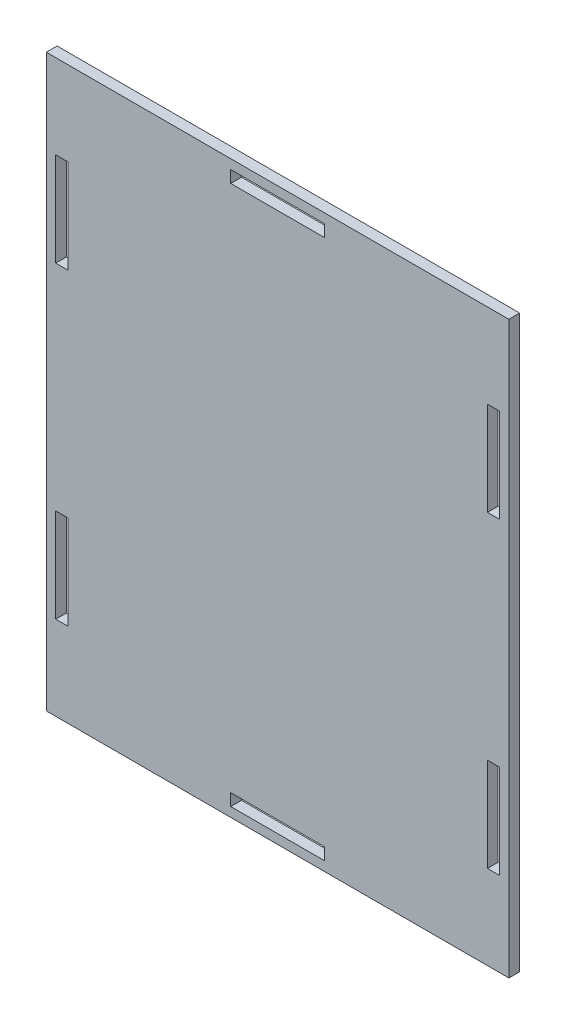
ISO-10303-21;
HEADER;
FILE_DESCRIPTION(('STEP AP214'),'2;1');
FILE_NAME('part.step','',(''),(''),'','','');
FILE_SCHEMA(('AUTOMOTIVE_DESIGN { 1 0 10303 214 1 1 1 1 }'));
ENDSEC;
DATA;
#1=APPLICATION_CONTEXT('core data for automotive mechanical design processes');
#2=APPLICATION_PROTOCOL_DEFINITION('international standard','automotive_design',2000,#1);
#3=PRODUCT_CONTEXT('',#1,'mechanical');
#4=PRODUCT('Part','Part','',(#3));
#5=PRODUCT_RELATED_PRODUCT_CATEGORY('part','',(#4));
#6=PRODUCT_DEFINITION_FORMATION('','',#4);
#7=PRODUCT_DEFINITION_CONTEXT('part definition',#1,'design');
#8=PRODUCT_DEFINITION('design','',#6,#7);
#9=PRODUCT_DEFINITION_SHAPE('','',#8);
#10=(LENGTH_UNIT() NAMED_UNIT(*) SI_UNIT(.MILLI.,.METRE.));
#11=(NAMED_UNIT(*) PLANE_ANGLE_UNIT() SI_UNIT($,.RADIAN.));
#12=(NAMED_UNIT(*) SI_UNIT($,.STERADIAN.) SOLID_ANGLE_UNIT());
#13=UNCERTAINTY_MEASURE_WITH_UNIT(LENGTH_MEASURE(1.E-05),#10,'distance_accuracy_value','');
#14=(GEOMETRIC_REPRESENTATION_CONTEXT(3) GLOBAL_UNCERTAINTY_ASSIGNED_CONTEXT((#13)) GLOBAL_UNIT_ASSIGNED_CONTEXT((#10,
#11,#12)) REPRESENTATION_CONTEXT('',''));
#15=CARTESIAN_POINT('',(0.,0.,0.));
#16=DIRECTION('',(0.,0.,1.));
#17=DIRECTION('',(1.,0.,0.));
#18=AXIS2_PLACEMENT_3D('',#15,#16,#17);
#19=CARTESIAN_POINT('',(0.,0.,3.5));
#20=DIRECTION('',(0.,0.,-1.));
#21=DIRECTION('',(-1.,0.,0.));
#22=AXIS2_PLACEMENT_3D('',#19,#20,#21);
#23=PLANE('',#22);
#24=DIRECTION('',(0.,1.,0.));
#25=VECTOR('',#24,1.);
#26=CARTESIAN_POINT('',(90.1999999999999,181.95,3.5));
#27=LINE('',#26,#25);
#28=CARTESIAN_POINT('',(90.1999999999999,178.05,3.5));
#29=VERTEX_POINT('',#28);
#30=CARTESIAN_POINT('',(90.1999999999999,181.95,3.5));
#31=VERTEX_POINT('',#30);
#32=EDGE_CURVE('E256',#29,#31,#27,.T.);
#33=ORIENTED_EDGE('',*,*,#32,.F.);
#34=DIRECTION('',(1.,0.,0.));
#35=VECTOR('',#34,1.);
#36=CARTESIAN_POINT('',(59.7999999999999,178.05,3.5));
#37=LINE('',#36,#35);
#38=CARTESIAN_POINT('',(59.7999999999999,178.05,3.5));
#39=VERTEX_POINT('',#38);
#40=EDGE_CURVE('E264',#39,#29,#37,.T.);
#41=ORIENTED_EDGE('',*,*,#40,.F.);
#42=DIRECTION('',(0.,-1.,0.));
#43=VECTOR('',#42,1.);
#44=CARTESIAN_POINT('',(59.7999999999999,181.95,3.5));
#45=LINE('',#44,#43);
#46=CARTESIAN_POINT('',(59.7999999999999,181.95,3.5));
#47=VERTEX_POINT('',#46);
#48=EDGE_CURVE('E261',#47,#39,#45,.T.);
#49=ORIENTED_EDGE('',*,*,#48,.F.);
#50=DIRECTION('',(-1.,0.,0.));
#51=VECTOR('',#50,1.);
#52=CARTESIAN_POINT('',(59.7999999999999,181.95,3.5));
#53=LINE('',#52,#51);
#54=EDGE_CURVE('E258',#31,#47,#53,.T.);
#55=ORIENTED_EDGE('',*,*,#54,.F.);
#56=EDGE_LOOP('',(#33,#41,#49,#55));
#57=FACE_BOUND('',#56,.T.);
#58=DIRECTION('',(0.,1.,0.));
#59=VECTOR('',#58,1.);
#60=CARTESIAN_POINT('',(146.95,57.7,3.5));
#61=LINE('',#60,#59);
#62=CARTESIAN_POINT('',(146.95,27.3,3.5));
#63=VERTEX_POINT('',#62);
#64=CARTESIAN_POINT('',(146.95,57.7,3.5));
#65=VERTEX_POINT('',#64);
#66=EDGE_CURVE('E318',#63,#65,#61,.T.);
#67=ORIENTED_EDGE('',*,*,#66,.F.);
#68=DIRECTION('',(1.,0.,0.));
#69=VECTOR('',#68,1.);
#70=CARTESIAN_POINT('',(146.95,27.3,3.5));
#71=LINE('',#70,#69);
#72=CARTESIAN_POINT('',(143.05,27.3,3.5));
#73=VERTEX_POINT('',#72);
#74=EDGE_CURVE('E326',#73,#63,#71,.T.);
#75=ORIENTED_EDGE('',*,*,#74,.F.);
#76=DIRECTION('',(0.,-1.,0.));
#77=VECTOR('',#76,1.);
#78=CARTESIAN_POINT('',(143.05,57.7,3.5));
#79=LINE('',#78,#77);
#80=CARTESIAN_POINT('',(143.05,57.7,3.5));
#81=VERTEX_POINT('',#80);
#82=EDGE_CURVE('E323',#81,#73,#79,.T.);
#83=ORIENTED_EDGE('',*,*,#82,.F.);
#84=DIRECTION('',(-1.,0.,0.));
#85=VECTOR('',#84,1.);
#86=CARTESIAN_POINT('',(146.95,57.7,3.5));
#87=LINE('',#86,#85);
#88=EDGE_CURVE('E320',#65,#81,#87,.T.);
#89=ORIENTED_EDGE('',*,*,#88,.F.);
#90=EDGE_LOOP('',(#67,#75,#83,#89));
#91=FACE_BOUND('',#90,.T.);
#92=DIRECTION('',(0.,-1.,0.));
#93=VECTOR('',#92,1.);
#94=CARTESIAN_POINT('',(3.05,57.7,3.5));
#95=LINE('',#94,#93);
#96=CARTESIAN_POINT('',(3.05,57.7,3.5));
#97=VERTEX_POINT('',#96);
#98=CARTESIAN_POINT('',(3.05,27.3,3.5));
#99=VERTEX_POINT('',#98);
#100=EDGE_CURVE('E380',#97,#99,#95,.T.);
#101=ORIENTED_EDGE('',*,*,#100,.F.);
#102=DIRECTION('',(-1.,0.,0.));
#103=VECTOR('',#102,1.);
#104=CARTESIAN_POINT('',(3.05,57.7,3.5));
#105=LINE('',#104,#103);
#106=CARTESIAN_POINT('',(6.95,57.7,3.5));
#107=VERTEX_POINT('',#106);
#108=EDGE_CURVE('E388',#107,#97,#105,.T.);
#109=ORIENTED_EDGE('',*,*,#108,.F.);
#110=DIRECTION('',(0.,1.,0.));
#111=VECTOR('',#110,1.);
#112=CARTESIAN_POINT('',(6.95,57.7,3.5));
#113=LINE('',#112,#111);
#114=CARTESIAN_POINT('',(6.95,27.3,3.5));
#115=VERTEX_POINT('',#114);
#116=EDGE_CURVE('E385',#115,#107,#113,.T.);
#117=ORIENTED_EDGE('',*,*,#116,.F.);
#118=DIRECTION('',(1.,0.,0.));
#119=VECTOR('',#118,1.);
#120=CARTESIAN_POINT('',(3.05,27.3,3.5));
#121=LINE('',#120,#119);
#122=EDGE_CURVE('E382',#99,#115,#121,.T.);
#123=ORIENTED_EDGE('',*,*,#122,.F.);
#124=EDGE_LOOP('',(#101,#109,#117,#123));
#125=FACE_BOUND('',#124,.T.);
#126=DIRECTION('',(0.,-1.,0.));
#127=VECTOR('',#126,1.);
#128=CARTESIAN_POINT('',(0.,0.,3.5));
#129=LINE('',#128,#127);
#130=CARTESIAN_POINT('',(0.,185.,3.5));
#131=VERTEX_POINT('',#130);
#132=CARTESIAN_POINT('',(0.,0.,3.5));
#133=VERTEX_POINT('',#132);
#134=EDGE_CURVE('E411',#131,#133,#129,.T.);
#135=ORIENTED_EDGE('',*,*,#134,.T.);
#136=DIRECTION('',(1.,0.,0.));
#137=VECTOR('',#136,1.);
#138=CARTESIAN_POINT('',(0.,0.,3.5));
#139=LINE('',#138,#137);
#140=CARTESIAN_POINT('',(150.,0.,3.5));
#141=VERTEX_POINT('',#140);
#142=EDGE_CURVE('E414',#133,#141,#139,.T.);
#143=ORIENTED_EDGE('',*,*,#142,.T.);
#144=DIRECTION('',(0.,1.,0.));
#145=VECTOR('',#144,1.);
#146=CARTESIAN_POINT('',(150.,0.,3.5));
#147=LINE('',#146,#145);
#148=CARTESIAN_POINT('',(150.,185.,3.5));
#149=VERTEX_POINT('',#148);
#150=EDGE_CURVE('E417',#141,#149,#147,.T.);
#151=ORIENTED_EDGE('',*,*,#150,.T.);
#152=DIRECTION('',(-1.,0.,0.));
#153=VECTOR('',#152,1.);
#154=CARTESIAN_POINT('',(0.,185.,3.5));
#155=LINE('',#154,#153);
#156=EDGE_CURVE('E419',#149,#131,#155,.T.);
#157=ORIENTED_EDGE('',*,*,#156,.T.);
#158=EDGE_LOOP('',(#135,#143,#151,#157));
#159=FACE_BOUND('',#158,.T.);
#160=DIRECTION('',(0.,-1.,0.));
#161=VECTOR('',#160,1.);
#162=CARTESIAN_POINT('',(3.05,157.7,3.5));
#163=LINE('',#162,#161);
#164=CARTESIAN_POINT('',(3.05,157.7,3.5));
#165=VERTEX_POINT('',#164);
#166=CARTESIAN_POINT('',(3.05,127.3,3.5));
#167=VERTEX_POINT('',#166);
#168=EDGE_CURVE('E349',#165,#167,#163,.T.);
#169=ORIENTED_EDGE('',*,*,#168,.F.);
#170=DIRECTION('',(-1.,0.,0.));
#171=VECTOR('',#170,1.);
#172=CARTESIAN_POINT('',(3.05,157.7,3.5));
#173=LINE('',#172,#171);
#174=CARTESIAN_POINT('',(6.95,157.7,3.5));
#175=VERTEX_POINT('',#174);
#176=EDGE_CURVE('E357',#175,#165,#173,.T.);
#177=ORIENTED_EDGE('',*,*,#176,.F.);
#178=DIRECTION('',(0.,1.,0.));
#179=VECTOR('',#178,1.);
#180=CARTESIAN_POINT('',(6.95,157.7,3.5));
#181=LINE('',#180,#179);
#182=CARTESIAN_POINT('',(6.95,127.3,3.5));
#183=VERTEX_POINT('',#182);
#184=EDGE_CURVE('E354',#183,#175,#181,.T.);
#185=ORIENTED_EDGE('',*,*,#184,.F.);
#186=DIRECTION('',(1.,0.,0.));
#187=VECTOR('',#186,1.);
#188=CARTESIAN_POINT('',(3.05,127.3,3.5));
#189=LINE('',#188,#187);
#190=EDGE_CURVE('E351',#167,#183,#189,.T.);
#191=ORIENTED_EDGE('',*,*,#190,.F.);
#192=EDGE_LOOP('',(#169,#177,#185,#191));
#193=FACE_BOUND('',#192,.T.);
#194=DIRECTION('',(0.,1.,0.));
#195=VECTOR('',#194,1.);
#196=CARTESIAN_POINT('',(146.95,157.7,3.5));
#197=LINE('',#196,#195);
#198=CARTESIAN_POINT('',(146.95,127.3,3.5));
#199=VERTEX_POINT('',#198);
#200=CARTESIAN_POINT('',(146.95,157.7,3.5));
#201=VERTEX_POINT('',#200);
#202=EDGE_CURVE('E287',#199,#201,#197,.T.);
#203=ORIENTED_EDGE('',*,*,#202,.F.);
#204=DIRECTION('',(1.,0.,0.));
#205=VECTOR('',#204,1.);
#206=CARTESIAN_POINT('',(146.95,127.3,3.5));
#207=LINE('',#206,#205);
#208=CARTESIAN_POINT('',(143.05,127.3,3.5));
#209=VERTEX_POINT('',#208);
#210=EDGE_CURVE('E295',#209,#199,#207,.T.);
#211=ORIENTED_EDGE('',*,*,#210,.F.);
#212=DIRECTION('',(0.,-1.,0.));
#213=VECTOR('',#212,1.);
#214=CARTESIAN_POINT('',(143.05,157.7,3.5));
#215=LINE('',#214,#213);
#216=CARTESIAN_POINT('',(143.05,157.7,3.5));
#217=VERTEX_POINT('',#216);
#218=EDGE_CURVE('E292',#217,#209,#215,.T.);
#219=ORIENTED_EDGE('',*,*,#218,.F.);
#220=DIRECTION('',(-1.,0.,0.));
#221=VECTOR('',#220,1.);
#222=CARTESIAN_POINT('',(146.95,157.7,3.5));
#223=LINE('',#222,#221);
#224=EDGE_CURVE('E289',#201,#217,#223,.T.);
#225=ORIENTED_EDGE('',*,*,#224,.F.);
#226=EDGE_LOOP('',(#203,#211,#219,#225));
#227=FACE_BOUND('',#226,.T.);
#228=DIRECTION('',(0.,-1.,0.));
#229=VECTOR('',#228,1.);
#230=CARTESIAN_POINT('',(59.7999999999999,3.05,3.5));
#231=LINE('',#230,#229);
#232=CARTESIAN_POINT('',(59.7999999999999,6.94999999999998,3.5));
#233=VERTEX_POINT('',#232);
#234=CARTESIAN_POINT('',(59.7999999999999,3.05,3.5));
#235=VERTEX_POINT('',#234);
#236=EDGE_CURVE('E220',#233,#235,#231,.T.);
#237=ORIENTED_EDGE('',*,*,#236,.F.);
#238=DIRECTION('',(-1.,0.,0.));
#239=VECTOR('',#238,1.);
#240=CARTESIAN_POINT('',(59.7999999999999,6.94999999999998,3.5));
#241=LINE('',#240,#239);
#242=CARTESIAN_POINT('',(90.1999999999999,6.94999999999998,3.5));
#243=VERTEX_POINT('',#242);
#244=EDGE_CURVE('E242',#243,#233,#241,.T.);
#245=ORIENTED_EDGE('',*,*,#244,.F.);
#246=DIRECTION('',(0.,1.,0.));
#247=VECTOR('',#246,1.);
#248=CARTESIAN_POINT('',(90.1999999999999,3.05,3.5));
#249=LINE('',#248,#247);
#250=CARTESIAN_POINT('',(90.1999999999999,3.05,3.5));
#251=VERTEX_POINT('',#250);
#252=EDGE_CURVE('E240',#251,#243,#249,.T.);
#253=ORIENTED_EDGE('',*,*,#252,.F.);
#254=DIRECTION('',(1.,0.,0.));
#255=VECTOR('',#254,1.);
#256=CARTESIAN_POINT('',(59.7999999999999,3.05,3.5));
#257=LINE('',#256,#255);
#258=EDGE_CURVE('E228',#235,#251,#257,.T.);
#259=ORIENTED_EDGE('',*,*,#258,.F.);
#260=EDGE_LOOP('',(#237,#245,#253,#259));
#261=FACE_BOUND('',#260,.T.);
#262=ADVANCED_FACE('F35',(#57,#91,#125,#159,#193,#227,#261),#23,.F.);
#263=CARTESIAN_POINT('',(0.,0.,0.));
#264=DIRECTION('',(0.,0.,-1.));
#265=DIRECTION('',(-1.,0.,0.));
#266=AXIS2_PLACEMENT_3D('',#263,#264,#265);
#267=PLANE('',#266);
#268=DIRECTION('',(0.,-1.,0.));
#269=VECTOR('',#268,1.);
#270=CARTESIAN_POINT('',(0.,0.,0.));
#271=LINE('',#270,#269);
#272=CARTESIAN_POINT('',(0.,185.,0.));
#273=VERTEX_POINT('',#272);
#274=CARTESIAN_POINT('',(0.,0.,0.));
#275=VERTEX_POINT('',#274);
#276=EDGE_CURVE('E410',#273,#275,#271,.T.);
#277=ORIENTED_EDGE('',*,*,#276,.F.);
#278=DIRECTION('',(-1.,0.,0.));
#279=VECTOR('',#278,1.);
#280=CARTESIAN_POINT('',(0.,185.,0.));
#281=LINE('',#280,#279);
#282=CARTESIAN_POINT('',(150.,185.,0.));
#283=VERTEX_POINT('',#282);
#284=EDGE_CURVE('E415',#283,#273,#281,.T.);
#285=ORIENTED_EDGE('',*,*,#284,.F.);
#286=DIRECTION('',(0.,1.,0.));
#287=VECTOR('',#286,1.);
#288=CARTESIAN_POINT('',(150.,0.,0.));
#289=LINE('',#288,#287);
#290=CARTESIAN_POINT('',(150.,0.,0.));
#291=VERTEX_POINT('',#290);
#292=EDGE_CURVE('E426',#291,#283,#289,.T.);
#293=ORIENTED_EDGE('',*,*,#292,.F.);
#294=DIRECTION('',(1.,0.,0.));
#295=VECTOR('',#294,1.);
#296=CARTESIAN_POINT('',(0.,0.,0.));
#297=LINE('',#296,#295);
#298=EDGE_CURVE('E424',#275,#291,#297,.T.);
#299=ORIENTED_EDGE('',*,*,#298,.F.);
#300=EDGE_LOOP('',(#277,#285,#293,#299));
#301=FACE_BOUND('',#300,.T.);
#302=DIRECTION('',(-1.,0.,0.));
#303=VECTOR('',#302,1.);
#304=CARTESIAN_POINT('',(3.05,57.7,0.));
#305=LINE('',#304,#303);
#306=CARTESIAN_POINT('',(6.95,57.7,0.));
#307=VERTEX_POINT('',#306);
#308=CARTESIAN_POINT('',(3.05,57.7,0.));
#309=VERTEX_POINT('',#308);
#310=EDGE_CURVE('E383',#307,#309,#305,.T.);
#311=ORIENTED_EDGE('',*,*,#310,.T.);
#312=DIRECTION('',(0.,-1.,0.));
#313=VECTOR('',#312,1.);
#314=CARTESIAN_POINT('',(3.05,57.7,0.));
#315=LINE('',#314,#313);
#316=CARTESIAN_POINT('',(3.05,27.3,0.));
#317=VERTEX_POINT('',#316);
#318=EDGE_CURVE('E379',#309,#317,#315,.T.);
#319=ORIENTED_EDGE('',*,*,#318,.T.);
#320=DIRECTION('',(1.,0.,0.));
#321=VECTOR('',#320,1.);
#322=CARTESIAN_POINT('',(3.05,27.3,0.));
#323=LINE('',#322,#321);
#324=CARTESIAN_POINT('',(6.95,27.3,0.));
#325=VERTEX_POINT('',#324);
#326=EDGE_CURVE('E393',#317,#325,#323,.T.);
#327=ORIENTED_EDGE('',*,*,#326,.T.);
#328=DIRECTION('',(0.,1.,0.));
#329=VECTOR('',#328,1.);
#330=CARTESIAN_POINT('',(6.95,57.7,0.));
#331=LINE('',#330,#329);
#332=EDGE_CURVE('E396',#325,#307,#331,.T.);
#333=ORIENTED_EDGE('',*,*,#332,.T.);
#334=EDGE_LOOP('',(#311,#319,#327,#333));
#335=FACE_BOUND('',#334,.T.);
#336=DIRECTION('',(-1.,0.,0.));
#337=VECTOR('',#336,1.);
#338=CARTESIAN_POINT('',(3.05,157.7,0.));
#339=LINE('',#338,#337);
#340=CARTESIAN_POINT('',(6.95,157.7,0.));
#341=VERTEX_POINT('',#340);
#342=CARTESIAN_POINT('',(3.05,157.7,0.));
#343=VERTEX_POINT('',#342);
#344=EDGE_CURVE('E352',#341,#343,#339,.T.);
#345=ORIENTED_EDGE('',*,*,#344,.T.);
#346=DIRECTION('',(0.,-1.,0.));
#347=VECTOR('',#346,1.);
#348=CARTESIAN_POINT('',(3.05,157.7,0.));
#349=LINE('',#348,#347);
#350=CARTESIAN_POINT('',(3.05,127.3,0.));
#351=VERTEX_POINT('',#350);
#352=EDGE_CURVE('E348',#343,#351,#349,.T.);
#353=ORIENTED_EDGE('',*,*,#352,.T.);
#354=DIRECTION('',(1.,0.,0.));
#355=VECTOR('',#354,1.);
#356=CARTESIAN_POINT('',(3.05,127.3,0.));
#357=LINE('',#356,#355);
#358=CARTESIAN_POINT('',(6.95,127.3,0.));
#359=VERTEX_POINT('',#358);
#360=EDGE_CURVE('E362',#351,#359,#357,.T.);
#361=ORIENTED_EDGE('',*,*,#360,.T.);
#362=DIRECTION('',(0.,1.,0.));
#363=VECTOR('',#362,1.);
#364=CARTESIAN_POINT('',(6.95,157.7,0.));
#365=LINE('',#364,#363);
#366=EDGE_CURVE('E365',#359,#341,#365,.T.);
#367=ORIENTED_EDGE('',*,*,#366,.T.);
#368=EDGE_LOOP('',(#345,#353,#361,#367));
#369=FACE_BOUND('',#368,.T.);
#370=DIRECTION('',(1.,0.,0.));
#371=VECTOR('',#370,1.);
#372=CARTESIAN_POINT('',(146.95,27.3,0.));
#373=LINE('',#372,#371);
#374=CARTESIAN_POINT('',(143.05,27.3,0.));
#375=VERTEX_POINT('',#374);
#376=CARTESIAN_POINT('',(146.95,27.3,0.));
#377=VERTEX_POINT('',#376);
#378=EDGE_CURVE('E321',#375,#377,#373,.T.);
#379=ORIENTED_EDGE('',*,*,#378,.T.);
#380=DIRECTION('',(0.,1.,0.));
#381=VECTOR('',#380,1.);
#382=CARTESIAN_POINT('',(146.95,57.7,0.));
#383=LINE('',#382,#381);
#384=CARTESIAN_POINT('',(146.95,57.7,0.));
#385=VERTEX_POINT('',#384);
#386=EDGE_CURVE('E317',#377,#385,#383,.T.);
#387=ORIENTED_EDGE('',*,*,#386,.T.);
#388=DIRECTION('',(-1.,0.,0.));
#389=VECTOR('',#388,1.);
#390=CARTESIAN_POINT('',(146.95,57.7,0.));
#391=LINE('',#390,#389);
#392=CARTESIAN_POINT('',(143.05,57.7,0.));
#393=VERTEX_POINT('',#392);
#394=EDGE_CURVE('E331',#385,#393,#391,.T.);
#395=ORIENTED_EDGE('',*,*,#394,.T.);
#396=DIRECTION('',(0.,-1.,0.));
#397=VECTOR('',#396,1.);
#398=CARTESIAN_POINT('',(143.05,57.7,0.));
#399=LINE('',#398,#397);
#400=EDGE_CURVE('E334',#393,#375,#399,.T.);
#401=ORIENTED_EDGE('',*,*,#400,.T.);
#402=EDGE_LOOP('',(#379,#387,#395,#401));
#403=FACE_BOUND('',#402,.T.);
#404=DIRECTION('',(1.,0.,0.));
#405=VECTOR('',#404,1.);
#406=CARTESIAN_POINT('',(146.95,127.3,0.));
#407=LINE('',#406,#405);
#408=CARTESIAN_POINT('',(143.05,127.3,0.));
#409=VERTEX_POINT('',#408);
#410=CARTESIAN_POINT('',(146.95,127.3,0.));
#411=VERTEX_POINT('',#410);
#412=EDGE_CURVE('E290',#409,#411,#407,.T.);
#413=ORIENTED_EDGE('',*,*,#412,.T.);
#414=DIRECTION('',(0.,1.,0.));
#415=VECTOR('',#414,1.);
#416=CARTESIAN_POINT('',(146.95,157.7,0.));
#417=LINE('',#416,#415);
#418=CARTESIAN_POINT('',(146.95,157.7,0.));
#419=VERTEX_POINT('',#418);
#420=EDGE_CURVE('E286',#411,#419,#417,.T.);
#421=ORIENTED_EDGE('',*,*,#420,.T.);
#422=DIRECTION('',(-1.,0.,0.));
#423=VECTOR('',#422,1.);
#424=CARTESIAN_POINT('',(146.95,157.7,0.));
#425=LINE('',#424,#423);
#426=CARTESIAN_POINT('',(143.05,157.7,0.));
#427=VERTEX_POINT('',#426);
#428=EDGE_CURVE('E300',#419,#427,#425,.T.);
#429=ORIENTED_EDGE('',*,*,#428,.T.);
#430=DIRECTION('',(0.,-1.,0.));
#431=VECTOR('',#430,1.);
#432=CARTESIAN_POINT('',(143.05,157.7,0.));
#433=LINE('',#432,#431);
#434=EDGE_CURVE('E303',#427,#409,#433,.T.);
#435=ORIENTED_EDGE('',*,*,#434,.T.);
#436=EDGE_LOOP('',(#413,#421,#429,#435));
#437=FACE_BOUND('',#436,.T.);
#438=DIRECTION('',(1.,0.,0.));
#439=VECTOR('',#438,1.);
#440=CARTESIAN_POINT('',(59.7999999999999,178.05,0.));
#441=LINE('',#440,#439);
#442=CARTESIAN_POINT('',(59.7999999999999,178.05,0.));
#443=VERTEX_POINT('',#442);
#444=CARTESIAN_POINT('',(90.1999999999999,178.05,0.));
#445=VERTEX_POINT('',#444);
#446=EDGE_CURVE('E259',#443,#445,#441,.T.);
#447=ORIENTED_EDGE('',*,*,#446,.T.);
#448=DIRECTION('',(0.,1.,0.));
#449=VECTOR('',#448,1.);
#450=CARTESIAN_POINT('',(90.1999999999999,181.95,0.));
#451=LINE('',#450,#449);
#452=CARTESIAN_POINT('',(90.1999999999999,181.95,0.));
#453=VERTEX_POINT('',#452);
#454=EDGE_CURVE('E236',#445,#453,#451,.T.);
#455=ORIENTED_EDGE('',*,*,#454,.T.);
#456=DIRECTION('',(-1.,0.,0.));
#457=VECTOR('',#456,1.);
#458=CARTESIAN_POINT('',(59.7999999999999,181.95,0.));
#459=LINE('',#458,#457);
#460=CARTESIAN_POINT('',(59.7999999999999,181.95,0.));
#461=VERTEX_POINT('',#460);
#462=EDGE_CURVE('E269',#453,#461,#459,.T.);
#463=ORIENTED_EDGE('',*,*,#462,.T.);
#464=DIRECTION('',(0.,-1.,0.));
#465=VECTOR('',#464,1.);
#466=CARTESIAN_POINT('',(59.7999999999999,181.95,0.));
#467=LINE('',#466,#465);
#468=EDGE_CURVE('E272',#461,#443,#467,.T.);
#469=ORIENTED_EDGE('',*,*,#468,.T.);
#470=EDGE_LOOP('',(#447,#455,#463,#469));
#471=FACE_BOUND('',#470,.T.);
#472=DIRECTION('',(-1.,0.,0.));
#473=VECTOR('',#472,1.);
#474=CARTESIAN_POINT('',(59.7999999999999,6.94999999999998,0.));
#475=LINE('',#474,#473);
#476=CARTESIAN_POINT('',(90.1999999999999,6.94999999999998,0.));
#477=VERTEX_POINT('',#476);
#478=CARTESIAN_POINT('',(59.7999999999999,6.94999999999998,0.));
#479=VERTEX_POINT('',#478);
#480=EDGE_CURVE('E229',#477,#479,#475,.T.);
#481=ORIENTED_EDGE('',*,*,#480,.T.);
#482=DIRECTION('',(0.,-1.,0.));
#483=VECTOR('',#482,1.);
#484=CARTESIAN_POINT('',(59.7999999999999,3.05,0.));
#485=LINE('',#484,#483);
#486=CARTESIAN_POINT('',(59.7999999999999,3.05,0.));
#487=VERTEX_POINT('',#486);
#488=EDGE_CURVE('E58',#479,#487,#485,.T.);
#489=ORIENTED_EDGE('',*,*,#488,.T.);
#490=DIRECTION('',(1.,0.,0.));
#491=VECTOR('',#490,1.);
#492=CARTESIAN_POINT('',(59.7999999999999,3.05,0.));
#493=LINE('',#492,#491);
#494=CARTESIAN_POINT('',(90.1999999999999,3.05,0.));
#495=VERTEX_POINT('',#494);
#496=EDGE_CURVE('E235',#487,#495,#493,.T.);
#497=ORIENTED_EDGE('',*,*,#496,.T.);
#498=DIRECTION('',(0.,1.,0.));
#499=VECTOR('',#498,1.);
#500=CARTESIAN_POINT('',(90.1999999999999,3.05,0.));
#501=LINE('',#500,#499);
#502=EDGE_CURVE('E248',#495,#477,#501,.T.);
#503=ORIENTED_EDGE('',*,*,#502,.T.);
#504=EDGE_LOOP('',(#481,#489,#497,#503));
#505=FACE_BOUND('',#504,.T.);
#506=ADVANCED_FACE('F444',(#301,#335,#369,#403,#437,#471,#505),#267,.T.);
#507=CARTESIAN_POINT('',(0.,0.,3.5));
#508=DIRECTION('',(1.,0.,0.));
#509=DIRECTION('',(0.,0.,-1.));
#510=AXIS2_PLACEMENT_3D('',#507,#508,#509);
#511=PLANE('',#510);
#512=ORIENTED_EDGE('',*,*,#276,.T.);
#513=DIRECTION('',(0.,0.,-1.));
#514=VECTOR('',#513,1.);
#515=CARTESIAN_POINT('',(0.,0.,3.5));
#516=LINE('',#515,#514);
#517=EDGE_CURVE('E11',#133,#275,#516,.T.);
#518=ORIENTED_EDGE('',*,*,#517,.F.);
#519=ORIENTED_EDGE('',*,*,#134,.F.);
#520=DIRECTION('',(0.,0.,-1.));
#521=VECTOR('',#520,1.);
#522=CARTESIAN_POINT('',(0.,185.,3.5));
#523=LINE('',#522,#521);
#524=EDGE_CURVE('E421',#131,#273,#523,.T.);
#525=ORIENTED_EDGE('',*,*,#524,.T.);
#526=EDGE_LOOP('',(#512,#518,#519,#525));
#527=FACE_BOUND('',#526,.T.);
#528=ADVANCED_FACE('F37',(#527),#511,.F.);
#529=CARTESIAN_POINT('',(0.,0.,3.5));
#530=DIRECTION('',(0.,1.,0.));
#531=DIRECTION('',(0.,0.,1.));
#532=AXIS2_PLACEMENT_3D('',#529,#530,#531);
#533=PLANE('',#532);
#534=ORIENTED_EDGE('',*,*,#298,.T.);
#535=DIRECTION('',(0.,0.,-1.));
#536=VECTOR('',#535,1.);
#537=CARTESIAN_POINT('',(150.,0.,3.5));
#538=LINE('',#537,#536);
#539=EDGE_CURVE('E43',#141,#291,#538,.T.);
#540=ORIENTED_EDGE('',*,*,#539,.F.);
#541=ORIENTED_EDGE('',*,*,#142,.F.);
#542=ORIENTED_EDGE('',*,*,#517,.T.);
#543=EDGE_LOOP('',(#534,#540,#541,#542));
#544=FACE_BOUND('',#543,.T.);
#545=ADVANCED_FACE('F455',(#544),#533,.F.);
#546=CARTESIAN_POINT('',(150.,0.,3.5));
#547=DIRECTION('',(-1.,0.,0.));
#548=DIRECTION('',(0.,0.,1.));
#549=AXIS2_PLACEMENT_3D('',#546,#547,#548);
#550=PLANE('',#549);
#551=ORIENTED_EDGE('',*,*,#292,.T.);
#552=DIRECTION('',(0.,0.,-1.));
#553=VECTOR('',#552,1.);
#554=CARTESIAN_POINT('',(150.,185.,3.5));
#555=LINE('',#554,#553);
#556=EDGE_CURVE('E431',#149,#283,#555,.T.);
#557=ORIENTED_EDGE('',*,*,#556,.F.);
#558=ORIENTED_EDGE('',*,*,#150,.F.);
#559=ORIENTED_EDGE('',*,*,#539,.T.);
#560=EDGE_LOOP('',(#551,#557,#558,#559));
#561=FACE_BOUND('',#560,.T.);
#562=ADVANCED_FACE('F438',(#561),#550,.F.);
#563=CARTESIAN_POINT('',(0.,185.,3.5));
#564=DIRECTION('',(0.,-1.,0.));
#565=DIRECTION('',(0.,0.,-1.));
#566=AXIS2_PLACEMENT_3D('',#563,#564,#565);
#567=PLANE('',#566);
#568=ORIENTED_EDGE('',*,*,#284,.T.);
#569=ORIENTED_EDGE('',*,*,#524,.F.);
#570=ORIENTED_EDGE('',*,*,#156,.F.);
#571=ORIENTED_EDGE('',*,*,#556,.T.);
#572=EDGE_LOOP('',(#568,#569,#570,#571));
#573=FACE_BOUND('',#572,.T.);
#574=ADVANCED_FACE('F448',(#573),#567,.F.);
#575=CARTESIAN_POINT('',(3.05,57.7,3.5));
#576=DIRECTION('',(1.,0.,0.));
#577=DIRECTION('',(0.,0.,-1.));
#578=AXIS2_PLACEMENT_3D('',#575,#576,#577);
#579=PLANE('',#578);
#580=ORIENTED_EDGE('',*,*,#318,.F.);
#581=DIRECTION('',(0.,0.,-1.));
#582=VECTOR('',#581,1.);
#583=CARTESIAN_POINT('',(3.05,57.7,3.5));
#584=LINE('',#583,#582);
#585=EDGE_CURVE('E390',#97,#309,#584,.T.);
#586=ORIENTED_EDGE('',*,*,#585,.F.);
#587=ORIENTED_EDGE('',*,*,#100,.T.);
#588=DIRECTION('',(0.,0.,-1.));
#589=VECTOR('',#588,1.);
#590=CARTESIAN_POINT('',(3.05,27.3,3.5));
#591=LINE('',#590,#589);
#592=EDGE_CURVE('E407',#99,#317,#591,.T.);
#593=ORIENTED_EDGE('',*,*,#592,.T.);
#594=EDGE_LOOP('',(#580,#586,#587,#593));
#595=FACE_BOUND('',#594,.T.);
#596=ADVANCED_FACE('F472',(#595),#579,.T.);
#597=CARTESIAN_POINT('',(3.05,27.3,3.5));
#598=DIRECTION('',(0.,1.,0.));
#599=DIRECTION('',(0.,0.,1.));
#600=AXIS2_PLACEMENT_3D('',#597,#598,#599);
#601=PLANE('',#600);
#602=ORIENTED_EDGE('',*,*,#326,.F.);
#603=ORIENTED_EDGE('',*,*,#592,.F.);
#604=ORIENTED_EDGE('',*,*,#122,.T.);
#605=DIRECTION('',(0.,0.,-1.));
#606=VECTOR('',#605,1.);
#607=CARTESIAN_POINT('',(6.95,27.3,3.5));
#608=LINE('',#607,#606);
#609=EDGE_CURVE('E405',#115,#325,#608,.T.);
#610=ORIENTED_EDGE('',*,*,#609,.T.);
#611=EDGE_LOOP('',(#602,#603,#604,#610));
#612=FACE_BOUND('',#611,.T.);
#613=ADVANCED_FACE('F479',(#612),#601,.T.);
#614=CARTESIAN_POINT('',(6.95,57.7,3.5));
#615=DIRECTION('',(-1.,0.,0.));
#616=DIRECTION('',(0.,0.,1.));
#617=AXIS2_PLACEMENT_3D('',#614,#615,#616);
#618=PLANE('',#617);
#619=ORIENTED_EDGE('',*,*,#332,.F.);
#620=ORIENTED_EDGE('',*,*,#609,.F.);
#621=ORIENTED_EDGE('',*,*,#116,.T.);
#622=DIRECTION('',(0.,0.,-1.));
#623=VECTOR('',#622,1.);
#624=CARTESIAN_POINT('',(6.95,57.7,3.5));
#625=LINE('',#624,#623);
#626=EDGE_CURVE('E403',#107,#307,#625,.T.);
#627=ORIENTED_EDGE('',*,*,#626,.T.);
#628=EDGE_LOOP('',(#619,#620,#621,#627));
#629=FACE_BOUND('',#628,.T.);
#630=ADVANCED_FACE('F484',(#629),#618,.T.);
#631=CARTESIAN_POINT('',(3.05,57.7,3.5));
#632=DIRECTION('',(0.,-1.,0.));
#633=DIRECTION('',(0.,0.,-1.));
#634=AXIS2_PLACEMENT_3D('',#631,#632,#633);
#635=PLANE('',#634);
#636=ORIENTED_EDGE('',*,*,#310,.F.);
#637=ORIENTED_EDGE('',*,*,#626,.F.);
#638=ORIENTED_EDGE('',*,*,#108,.T.);
#639=ORIENTED_EDGE('',*,*,#585,.T.);
#640=EDGE_LOOP('',(#636,#637,#638,#639));
#641=FACE_BOUND('',#640,.T.);
#642=ADVANCED_FACE('F491',(#641),#635,.T.);
#643=CARTESIAN_POINT('',(3.05,157.7,3.5));
#644=DIRECTION('',(1.,0.,0.));
#645=DIRECTION('',(0.,0.,-1.));
#646=AXIS2_PLACEMENT_3D('',#643,#644,#645);
#647=PLANE('',#646);
#648=ORIENTED_EDGE('',*,*,#352,.F.);
#649=DIRECTION('',(0.,0.,-1.));
#650=VECTOR('',#649,1.);
#651=CARTESIAN_POINT('',(3.05,157.7,3.5));
#652=LINE('',#651,#650);
#653=EDGE_CURVE('E359',#165,#343,#652,.T.);
#654=ORIENTED_EDGE('',*,*,#653,.F.);
#655=ORIENTED_EDGE('',*,*,#168,.T.);
#656=DIRECTION('',(0.,0.,-1.));
#657=VECTOR('',#656,1.);
#658=CARTESIAN_POINT('',(3.05,127.3,3.5));
#659=LINE('',#658,#657);
#660=EDGE_CURVE('E376',#167,#351,#659,.T.);
#661=ORIENTED_EDGE('',*,*,#660,.T.);
#662=EDGE_LOOP('',(#648,#654,#655,#661));
#663=FACE_BOUND('',#662,.T.);
#664=ADVANCED_FACE('F505',(#663),#647,.T.);
#665=CARTESIAN_POINT('',(3.05,127.3,3.5));
#666=DIRECTION('',(0.,1.,0.));
#667=DIRECTION('',(0.,0.,1.));
#668=AXIS2_PLACEMENT_3D('',#665,#666,#667);
#669=PLANE('',#668);
#670=ORIENTED_EDGE('',*,*,#360,.F.);
#671=ORIENTED_EDGE('',*,*,#660,.F.);
#672=ORIENTED_EDGE('',*,*,#190,.T.);
#673=DIRECTION('',(0.,0.,-1.));
#674=VECTOR('',#673,1.);
#675=CARTESIAN_POINT('',(6.95,127.3,3.5));
#676=LINE('',#675,#674);
#677=EDGE_CURVE('E374',#183,#359,#676,.T.);
#678=ORIENTED_EDGE('',*,*,#677,.T.);
#679=EDGE_LOOP('',(#670,#671,#672,#678));
#680=FACE_BOUND('',#679,.T.);
#681=ADVANCED_FACE('F510',(#680),#669,.T.);
#682=CARTESIAN_POINT('',(6.95,157.7,3.5));
#683=DIRECTION('',(-1.,0.,0.));
#684=DIRECTION('',(0.,0.,1.));
#685=AXIS2_PLACEMENT_3D('',#682,#683,#684);
#686=PLANE('',#685);
#687=ORIENTED_EDGE('',*,*,#366,.F.);
#688=ORIENTED_EDGE('',*,*,#677,.F.);
#689=ORIENTED_EDGE('',*,*,#184,.T.);
#690=DIRECTION('',(0.,0.,-1.));
#691=VECTOR('',#690,1.);
#692=CARTESIAN_POINT('',(6.95,157.7,3.5));
#693=LINE('',#692,#691);
#694=EDGE_CURVE('E372',#175,#341,#693,.T.);
#695=ORIENTED_EDGE('',*,*,#694,.T.);
#696=EDGE_LOOP('',(#687,#688,#689,#695));
#697=FACE_BOUND('',#696,.T.);
#698=ADVANCED_FACE('F514',(#697),#686,.T.);
#699=CARTESIAN_POINT('',(3.05,157.7,3.5));
#700=DIRECTION('',(0.,-1.,0.));
#701=DIRECTION('',(0.,0.,-1.));
#702=AXIS2_PLACEMENT_3D('',#699,#700,#701);
#703=PLANE('',#702);
#704=ORIENTED_EDGE('',*,*,#344,.F.);
#705=ORIENTED_EDGE('',*,*,#694,.F.);
#706=ORIENTED_EDGE('',*,*,#176,.T.);
#707=ORIENTED_EDGE('',*,*,#653,.T.);
#708=EDGE_LOOP('',(#704,#705,#706,#707));
#709=FACE_BOUND('',#708,.T.);
#710=ADVANCED_FACE('F518',(#709),#703,.T.);
#711=CARTESIAN_POINT('',(146.95,57.7,3.5));
#712=DIRECTION('',(-1.,0.,0.));
#713=DIRECTION('',(0.,0.,1.));
#714=AXIS2_PLACEMENT_3D('',#711,#712,#713);
#715=PLANE('',#714);
#716=ORIENTED_EDGE('',*,*,#386,.F.);
#717=DIRECTION('',(0.,0.,-1.));
#718=VECTOR('',#717,1.);
#719=CARTESIAN_POINT('',(146.95,27.3,3.5));
#720=LINE('',#719,#718);
#721=EDGE_CURVE('E328',#63,#377,#720,.T.);
#722=ORIENTED_EDGE('',*,*,#721,.F.);
#723=ORIENTED_EDGE('',*,*,#66,.T.);
#724=DIRECTION('',(0.,0.,-1.));
#725=VECTOR('',#724,1.);
#726=CARTESIAN_POINT('',(146.95,57.7,3.5));
#727=LINE('',#726,#725);
#728=EDGE_CURVE('E345',#65,#385,#727,.T.);
#729=ORIENTED_EDGE('',*,*,#728,.T.);
#730=EDGE_LOOP('',(#716,#722,#723,#729));
#731=FACE_BOUND('',#730,.T.);
#732=ADVANCED_FACE('F522',(#731),#715,.T.);
#733=CARTESIAN_POINT('',(146.95,57.7,3.5));
#734=DIRECTION('',(0.,-1.,0.));
#735=DIRECTION('',(0.,0.,-1.));
#736=AXIS2_PLACEMENT_3D('',#733,#734,#735);
#737=PLANE('',#736);
#738=ORIENTED_EDGE('',*,*,#394,.F.);
#739=ORIENTED_EDGE('',*,*,#728,.F.);
#740=ORIENTED_EDGE('',*,*,#88,.T.);
#741=DIRECTION('',(0.,0.,-1.));
#742=VECTOR('',#741,1.);
#743=CARTESIAN_POINT('',(143.05,57.7,3.5));
#744=LINE('',#743,#742);
#745=EDGE_CURVE('E343',#81,#393,#744,.T.);
#746=ORIENTED_EDGE('',*,*,#745,.T.);
#747=EDGE_LOOP('',(#738,#739,#740,#746));
#748=FACE_BOUND('',#747,.T.);
#749=ADVANCED_FACE('F526',(#748),#737,.T.);
#750=CARTESIAN_POINT('',(143.05,57.7,3.5));
#751=DIRECTION('',(1.,0.,0.));
#752=DIRECTION('',(0.,0.,-1.));
#753=AXIS2_PLACEMENT_3D('',#750,#751,#752);
#754=PLANE('',#753);
#755=ORIENTED_EDGE('',*,*,#400,.F.);
#756=ORIENTED_EDGE('',*,*,#745,.F.);
#757=ORIENTED_EDGE('',*,*,#82,.T.);
#758=DIRECTION('',(0.,0.,-1.));
#759=VECTOR('',#758,1.);
#760=CARTESIAN_POINT('',(143.05,27.3,3.5));
#761=LINE('',#760,#759);
#762=EDGE_CURVE('E341',#73,#375,#761,.T.);
#763=ORIENTED_EDGE('',*,*,#762,.T.);
#764=EDGE_LOOP('',(#755,#756,#757,#763));
#765=FACE_BOUND('',#764,.T.);
#766=ADVANCED_FACE('F530',(#765),#754,.T.);
#767=CARTESIAN_POINT('',(146.95,27.3,3.5));
#768=DIRECTION('',(0.,1.,0.));
#769=DIRECTION('',(0.,0.,1.));
#770=AXIS2_PLACEMENT_3D('',#767,#768,#769);
#771=PLANE('',#770);
#772=ORIENTED_EDGE('',*,*,#378,.F.);
#773=ORIENTED_EDGE('',*,*,#762,.F.);
#774=ORIENTED_EDGE('',*,*,#74,.T.);
#775=ORIENTED_EDGE('',*,*,#721,.T.);
#776=EDGE_LOOP('',(#772,#773,#774,#775));
#777=FACE_BOUND('',#776,.T.);
#778=ADVANCED_FACE('F534',(#777),#771,.T.);
#779=CARTESIAN_POINT('',(146.95,157.7,3.5));
#780=DIRECTION('',(-1.,0.,0.));
#781=DIRECTION('',(0.,0.,1.));
#782=AXIS2_PLACEMENT_3D('',#779,#780,#781);
#783=PLANE('',#782);
#784=ORIENTED_EDGE('',*,*,#420,.F.);
#785=DIRECTION('',(0.,0.,-1.));
#786=VECTOR('',#785,1.);
#787=CARTESIAN_POINT('',(146.95,127.3,3.5));
#788=LINE('',#787,#786);
#789=EDGE_CURVE('E297',#199,#411,#788,.T.);
#790=ORIENTED_EDGE('',*,*,#789,.F.);
#791=ORIENTED_EDGE('',*,*,#202,.T.);
#792=DIRECTION('',(0.,0.,-1.));
#793=VECTOR('',#792,1.);
#794=CARTESIAN_POINT('',(146.95,157.7,3.5));
#795=LINE('',#794,#793);
#796=EDGE_CURVE('E314',#201,#419,#795,.T.);
#797=ORIENTED_EDGE('',*,*,#796,.T.);
#798=EDGE_LOOP('',(#784,#790,#791,#797));
#799=FACE_BOUND('',#798,.T.);
#800=ADVANCED_FACE('F538',(#799),#783,.T.);
#801=CARTESIAN_POINT('',(146.95,157.7,3.5));
#802=DIRECTION('',(0.,-1.,0.));
#803=DIRECTION('',(0.,0.,-1.));
#804=AXIS2_PLACEMENT_3D('',#801,#802,#803);
#805=PLANE('',#804);
#806=ORIENTED_EDGE('',*,*,#428,.F.);
#807=ORIENTED_EDGE('',*,*,#796,.F.);
#808=ORIENTED_EDGE('',*,*,#224,.T.);
#809=DIRECTION('',(0.,0.,-1.));
#810=VECTOR('',#809,1.);
#811=CARTESIAN_POINT('',(143.05,157.7,3.5));
#812=LINE('',#811,#810);
#813=EDGE_CURVE('E312',#217,#427,#812,.T.);
#814=ORIENTED_EDGE('',*,*,#813,.T.);
#815=EDGE_LOOP('',(#806,#807,#808,#814));
#816=FACE_BOUND('',#815,.T.);
#817=ADVANCED_FACE('F542',(#816),#805,.T.);
#818=CARTESIAN_POINT('',(143.05,157.7,3.5));
#819=DIRECTION('',(1.,0.,0.));
#820=DIRECTION('',(0.,0.,-1.));
#821=AXIS2_PLACEMENT_3D('',#818,#819,#820);
#822=PLANE('',#821);
#823=ORIENTED_EDGE('',*,*,#434,.F.);
#824=ORIENTED_EDGE('',*,*,#813,.F.);
#825=ORIENTED_EDGE('',*,*,#218,.T.);
#826=DIRECTION('',(0.,0.,-1.));
#827=VECTOR('',#826,1.);
#828=CARTESIAN_POINT('',(143.05,127.3,3.5));
#829=LINE('',#828,#827);
#830=EDGE_CURVE('E310',#209,#409,#829,.T.);
#831=ORIENTED_EDGE('',*,*,#830,.T.);
#832=EDGE_LOOP('',(#823,#824,#825,#831));
#833=FACE_BOUND('',#832,.T.);
#834=ADVANCED_FACE('F546',(#833),#822,.T.);
#835=CARTESIAN_POINT('',(146.95,127.3,3.5));
#836=DIRECTION('',(0.,1.,0.));
#837=DIRECTION('',(0.,0.,1.));
#838=AXIS2_PLACEMENT_3D('',#835,#836,#837);
#839=PLANE('',#838);
#840=ORIENTED_EDGE('',*,*,#412,.F.);
#841=ORIENTED_EDGE('',*,*,#830,.F.);
#842=ORIENTED_EDGE('',*,*,#210,.T.);
#843=ORIENTED_EDGE('',*,*,#789,.T.);
#844=EDGE_LOOP('',(#840,#841,#842,#843));
#845=FACE_BOUND('',#844,.T.);
#846=ADVANCED_FACE('F550',(#845),#839,.T.);
#847=CARTESIAN_POINT('',(90.1999999999999,181.95,3.5));
#848=DIRECTION('',(-1.,0.,0.));
#849=DIRECTION('',(0.,0.,1.));
#850=AXIS2_PLACEMENT_3D('',#847,#848,#849);
#851=PLANE('',#850);
#852=ORIENTED_EDGE('',*,*,#454,.F.);
#853=DIRECTION('',(0.,0.,-1.));
#854=VECTOR('',#853,1.);
#855=CARTESIAN_POINT('',(90.1999999999999,178.05,3.5));
#856=LINE('',#855,#854);
#857=EDGE_CURVE('E266',#29,#445,#856,.T.);
#858=ORIENTED_EDGE('',*,*,#857,.F.);
#859=ORIENTED_EDGE('',*,*,#32,.T.);
#860=DIRECTION('',(0.,0.,-1.));
#861=VECTOR('',#860,1.);
#862=CARTESIAN_POINT('',(90.1999999999999,181.95,3.5));
#863=LINE('',#862,#861);
#864=EDGE_CURVE('E283',#31,#453,#863,.T.);
#865=ORIENTED_EDGE('',*,*,#864,.T.);
#866=EDGE_LOOP('',(#852,#858,#859,#865));
#867=FACE_BOUND('',#866,.T.);
#868=ADVANCED_FACE('F554',(#867),#851,.T.);
#869=CARTESIAN_POINT('',(59.7999999999999,181.95,3.5));
#870=DIRECTION('',(0.,-1.,0.));
#871=DIRECTION('',(0.,0.,-1.));
#872=AXIS2_PLACEMENT_3D('',#869,#870,#871);
#873=PLANE('',#872);
#874=ORIENTED_EDGE('',*,*,#462,.F.);
#875=ORIENTED_EDGE('',*,*,#864,.F.);
#876=ORIENTED_EDGE('',*,*,#54,.T.);
#877=DIRECTION('',(0.,0.,-1.));
#878=VECTOR('',#877,1.);
#879=CARTESIAN_POINT('',(59.7999999999999,181.95,3.5));
#880=LINE('',#879,#878);
#881=EDGE_CURVE('E281',#47,#461,#880,.T.);
#882=ORIENTED_EDGE('',*,*,#881,.T.);
#883=EDGE_LOOP('',(#874,#875,#876,#882));
#884=FACE_BOUND('',#883,.T.);
#885=ADVANCED_FACE('F558',(#884),#873,.T.);
#886=CARTESIAN_POINT('',(59.7999999999999,181.95,3.5));
#887=DIRECTION('',(1.,0.,0.));
#888=DIRECTION('',(0.,0.,-1.));
#889=AXIS2_PLACEMENT_3D('',#886,#887,#888);
#890=PLANE('',#889);
#891=ORIENTED_EDGE('',*,*,#468,.F.);
#892=ORIENTED_EDGE('',*,*,#881,.F.);
#893=ORIENTED_EDGE('',*,*,#48,.T.);
#894=DIRECTION('',(0.,0.,-1.));
#895=VECTOR('',#894,1.);
#896=CARTESIAN_POINT('',(59.7999999999999,178.05,3.5));
#897=LINE('',#896,#895);
#898=EDGE_CURVE('E279',#39,#443,#897,.T.);
#899=ORIENTED_EDGE('',*,*,#898,.T.);
#900=EDGE_LOOP('',(#891,#892,#893,#899));
#901=FACE_BOUND('',#900,.T.);
#902=ADVANCED_FACE('F562',(#901),#890,.T.);
#903=CARTESIAN_POINT('',(59.7999999999999,178.05,3.5));
#904=DIRECTION('',(0.,1.,0.));
#905=DIRECTION('',(0.,0.,1.));
#906=AXIS2_PLACEMENT_3D('',#903,#904,#905);
#907=PLANE('',#906);
#908=ORIENTED_EDGE('',*,*,#446,.F.);
#909=ORIENTED_EDGE('',*,*,#898,.F.);
#910=ORIENTED_EDGE('',*,*,#40,.T.);
#911=ORIENTED_EDGE('',*,*,#857,.T.);
#912=EDGE_LOOP('',(#908,#909,#910,#911));
#913=FACE_BOUND('',#912,.T.);
#914=ADVANCED_FACE('F566',(#913),#907,.T.);
#915=CARTESIAN_POINT('',(59.7999999999999,3.05,3.5));
#916=DIRECTION('',(1.,0.,0.));
#917=DIRECTION('',(0.,0.,-1.));
#918=AXIS2_PLACEMENT_3D('',#915,#916,#917);
#919=PLANE('',#918);
#920=ORIENTED_EDGE('',*,*,#488,.F.);
#921=DIRECTION('',(0.,0.,-1.));
#922=VECTOR('',#921,1.);
#923=CARTESIAN_POINT('',(59.7999999999999,6.94999999999998,3.5));
#924=LINE('',#923,#922);
#925=EDGE_CURVE('E224',#233,#479,#924,.T.);
#926=ORIENTED_EDGE('',*,*,#925,.F.);
#927=ORIENTED_EDGE('',*,*,#236,.T.);
#928=DIRECTION('',(0.,0.,-1.));
#929=VECTOR('',#928,1.);
#930=CARTESIAN_POINT('',(59.7999999999999,3.05,3.5));
#931=LINE('',#930,#929);
#932=EDGE_CURVE('E223',#235,#487,#931,.T.);
#933=ORIENTED_EDGE('',*,*,#932,.T.);
#934=EDGE_LOOP('',(#920,#926,#927,#933));
#935=FACE_BOUND('',#934,.T.);
#936=ADVANCED_FACE('F222',(#935),#919,.T.);
#937=CARTESIAN_POINT('',(59.7999999999999,3.05,3.5));
#938=DIRECTION('',(0.,1.,0.));
#939=DIRECTION('',(0.,0.,1.));
#940=AXIS2_PLACEMENT_3D('',#937,#938,#939);
#941=PLANE('',#940);
#942=ORIENTED_EDGE('',*,*,#496,.F.);
#943=ORIENTED_EDGE('',*,*,#932,.F.);
#944=ORIENTED_EDGE('',*,*,#258,.T.);
#945=DIRECTION('',(0.,0.,-1.));
#946=VECTOR('',#945,1.);
#947=CARTESIAN_POINT('',(90.1999999999999,3.05,3.5));
#948=LINE('',#947,#946);
#949=EDGE_CURVE('E237',#251,#495,#948,.T.);
#950=ORIENTED_EDGE('',*,*,#949,.T.);
#951=EDGE_LOOP('',(#942,#943,#944,#950));
#952=FACE_BOUND('',#951,.T.);
#953=ADVANCED_FACE('F232',(#952),#941,.T.);
#954=CARTESIAN_POINT('',(90.1999999999999,3.05,3.5));
#955=DIRECTION('',(-1.,0.,0.));
#956=DIRECTION('',(0.,0.,1.));
#957=AXIS2_PLACEMENT_3D('',#954,#955,#956);
#958=PLANE('',#957);
#959=ORIENTED_EDGE('',*,*,#502,.F.);
#960=ORIENTED_EDGE('',*,*,#949,.F.);
#961=ORIENTED_EDGE('',*,*,#252,.T.);
#962=DIRECTION('',(0.,0.,-1.));
#963=VECTOR('',#962,1.);
#964=CARTESIAN_POINT('',(90.1999999999999,6.94999999999998,3.5));
#965=LINE('',#964,#963);
#966=EDGE_CURVE('E50',#243,#477,#965,.T.);
#967=ORIENTED_EDGE('',*,*,#966,.T.);
#968=EDGE_LOOP('',(#959,#960,#961,#967));
#969=FACE_BOUND('',#968,.T.);
#970=ADVANCED_FACE('F575',(#969),#958,.T.);
#971=CARTESIAN_POINT('',(59.7999999999999,6.94999999999998,3.5));
#972=DIRECTION('',(0.,-1.,0.));
#973=DIRECTION('',(0.,0.,-1.));
#974=AXIS2_PLACEMENT_3D('',#971,#972,#973);
#975=PLANE('',#974);
#976=ORIENTED_EDGE('',*,*,#480,.F.);
#977=ORIENTED_EDGE('',*,*,#966,.F.);
#978=ORIENTED_EDGE('',*,*,#244,.T.);
#979=ORIENTED_EDGE('',*,*,#925,.T.);
#980=EDGE_LOOP('',(#976,#977,#978,#979));
#981=FACE_BOUND('',#980,.T.);
#982=ADVANCED_FACE('F578',(#981),#975,.T.);
#983=CLOSED_SHELL('',(#262,#506,#528,#545,#562,#574,#596,#613,#630,#642,#664,#681,#698,#710,
#732,#749,#766,#778,#800,#817,#834,#846,#868,#885,#902,#914,#936,#953,#970,#982));
#984=MANIFOLD_SOLID_BREP('B2',#983);
#985=ADVANCED_BREP_SHAPE_REPRESENTATION('',(#18,#984),#14);
#986=SHAPE_DEFINITION_REPRESENTATION(#9,#985);
ENDSEC;
END-ISO-10303-21;
